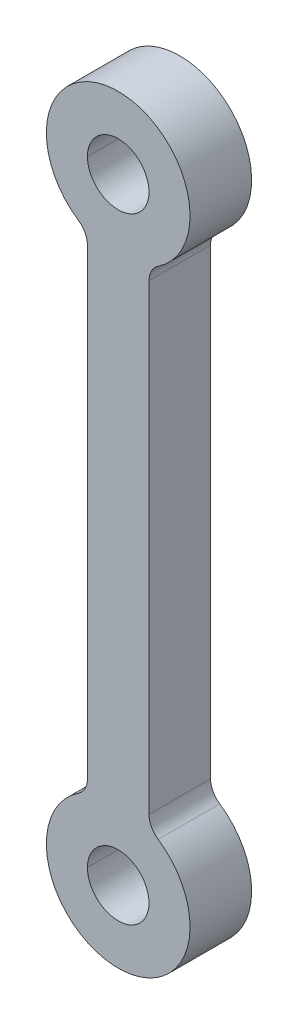
ISO-10303-21;
HEADER;
FILE_DESCRIPTION(('STEP AP214'),'2;1');
FILE_NAME('part.step','',(''),(''),'','','');
FILE_SCHEMA(('AUTOMOTIVE_DESIGN { 1 0 10303 214 1 1 1 1 }'));
ENDSEC;
DATA;
#1=APPLICATION_CONTEXT('core data for automotive mechanical design processes');
#2=APPLICATION_PROTOCOL_DEFINITION('international standard','automotive_design',2000,#1);
#3=PRODUCT_CONTEXT('',#1,'mechanical');
#4=PRODUCT('Part','Part','',(#3));
#5=PRODUCT_RELATED_PRODUCT_CATEGORY('part','',(#4));
#6=PRODUCT_DEFINITION_FORMATION('','',#4);
#7=PRODUCT_DEFINITION_CONTEXT('part definition',#1,'design');
#8=PRODUCT_DEFINITION('design','',#6,#7);
#9=PRODUCT_DEFINITION_SHAPE('','',#8);
#10=(LENGTH_UNIT() NAMED_UNIT(*) SI_UNIT(.MILLI.,.METRE.));
#11=(NAMED_UNIT(*) PLANE_ANGLE_UNIT() SI_UNIT($,.RADIAN.));
#12=(NAMED_UNIT(*) SI_UNIT($,.STERADIAN.) SOLID_ANGLE_UNIT());
#13=UNCERTAINTY_MEASURE_WITH_UNIT(LENGTH_MEASURE(1.E-05),#10,'distance_accuracy_value','');
#14=(GEOMETRIC_REPRESENTATION_CONTEXT(3) GLOBAL_UNCERTAINTY_ASSIGNED_CONTEXT((#13)) GLOBAL_UNIT_ASSIGNED_CONTEXT((#10,
#11,#12)) REPRESENTATION_CONTEXT('',''));
#15=CARTESIAN_POINT('',(0.,0.,0.));
#16=DIRECTION('',(0.,0.,1.));
#17=DIRECTION('',(1.,0.,0.));
#18=AXIS2_PLACEMENT_3D('',#15,#16,#17);
#19=CARTESIAN_POINT('',(-2.5,11.258342613226,1.5));
#20=DIRECTION('',(0.,0.,-1.));
#21=DIRECTION('',(1.,0.,0.));
#22=AXIS2_PLACEMENT_3D('',#19,#20,#21);
#23=CYLINDRICAL_SURFACE('',#22,1.);
#24=DIRECTION('',(0.,0.,-1.));
#25=VECTOR('',#24,1.);
#26=CARTESIAN_POINT('',(-1.5,11.258342613226,1.5));
#27=LINE('',#26,#25);
#28=CARTESIAN_POINT('',(-1.5,11.258342613226,3.));
#29=VERTEX_POINT('',#28);
#30=CARTESIAN_POINT('',(-1.5,11.258342613226,0.));
#31=VERTEX_POINT('',#30);
#32=EDGE_CURVE('E10',#29,#31,#27,.T.);
#33=ORIENTED_EDGE('',*,*,#32,.F.);
#34=CARTESIAN_POINT('',(-2.5,11.258342613226,3.));
#35=DIRECTION('',(0.,0.,-1.));
#36=DIRECTION('',(1.,0.,0.));
#37=AXIS2_PLACEMENT_3D('',#34,#35,#36);
#38=CIRCLE('',#37,1.);
#39=CARTESIAN_POINT('',(-1.94444444444444,12.0898220325091,3.));
#40=VERTEX_POINT('',#39);
#41=EDGE_CURVE('E254',#40,#29,#38,.T.);
#42=ORIENTED_EDGE('',*,*,#41,.F.);
#43=DIRECTION('',(0.,0.,-1.));
#44=VECTOR('',#43,1.);
#45=CARTESIAN_POINT('',(-1.94444444444443,12.0898220325091,1.5));
#46=LINE('',#45,#44);
#47=CARTESIAN_POINT('',(-1.94444444444444,12.0898220325091,0.));
#48=VERTEX_POINT('',#47);
#49=EDGE_CURVE('E26',#40,#48,#46,.T.);
#50=ORIENTED_EDGE('',*,*,#49,.T.);
#51=CARTESIAN_POINT('',(-2.5,11.258342613226,0.));
#52=DIRECTION('',(0.,0.,1.));
#53=DIRECTION('',(1.,0.,0.));
#54=AXIS2_PLACEMENT_3D('',#51,#52,#53);
#55=CIRCLE('',#54,1.);
#56=EDGE_CURVE('E175',#31,#48,#55,.T.);
#57=ORIENTED_EDGE('',*,*,#56,.F.);
#58=EDGE_LOOP('',(#33,#42,#50,#57));
#59=FACE_BOUND('',#58,.T.);
#60=ADVANCED_FACE('F17',(#59),#23,.F.);
#61=CARTESIAN_POINT('',(-1.5,11.8377223398316,0.));
#62=DIRECTION('',(-1.,0.,0.));
#63=DIRECTION('',(0.,-1.,0.));
#64=AXIS2_PLACEMENT_3D('',#61,#62,#63);
#65=PLANE('',#64);
#66=DIRECTION('',(0.,-1.,0.));
#67=VECTOR('',#66,1.);
#68=CARTESIAN_POINT('',(-1.5,0.,0.));
#69=LINE('',#68,#67);
#70=CARTESIAN_POINT('',(-1.5,-11.2583426132261,0.));
#71=VERTEX_POINT('',#70);
#72=EDGE_CURVE('E172',#31,#71,#69,.T.);
#73=ORIENTED_EDGE('',*,*,#72,.T.);
#74=DIRECTION('',(0.,0.,-1.));
#75=VECTOR('',#74,1.);
#76=CARTESIAN_POINT('',(-1.5,-11.2583426132261,1.5));
#77=LINE('',#76,#75);
#78=CARTESIAN_POINT('',(-1.5,-11.2583426132261,3.));
#79=VERTEX_POINT('',#78);
#80=EDGE_CURVE('E204',#79,#71,#77,.T.);
#81=ORIENTED_EDGE('',*,*,#80,.F.);
#82=DIRECTION('',(0.,-1.,0.));
#83=VECTOR('',#82,1.);
#84=CARTESIAN_POINT('',(-1.5,0.,3.));
#85=LINE('',#84,#83);
#86=EDGE_CURVE('E258',#29,#79,#85,.T.);
#87=ORIENTED_EDGE('',*,*,#86,.F.);
#88=ORIENTED_EDGE('',*,*,#32,.T.);
#89=EDGE_LOOP('',(#73,#81,#87,#88));
#90=FACE_BOUND('',#89,.T.);
#91=ADVANCED_FACE('F19',(#90),#65,.T.);
#92=CARTESIAN_POINT('',(0.,15.,1.5));
#93=DIRECTION('',(0.,0.,-1.));
#94=DIRECTION('',(1.,0.,0.));
#95=AXIS2_PLACEMENT_3D('',#92,#93,#94);
#96=CYLINDRICAL_SURFACE('',#95,3.5);
#97=CARTESIAN_POINT('',(0.,15.,3.));
#98=DIRECTION('',(0.,0.,1.));
#99=DIRECTION('',(1.,0.,0.));
#100=AXIS2_PLACEMENT_3D('',#97,#98,#99);
#101=CIRCLE('',#100,3.5);
#102=CARTESIAN_POINT('',(1.94444444444443,12.0898220325091,3.));
#103=VERTEX_POINT('',#102);
#104=EDGE_CURVE('E261',#103,#40,#101,.T.);
#105=ORIENTED_EDGE('',*,*,#104,.F.);
#106=DIRECTION('',(0.,0.,-1.));
#107=VECTOR('',#106,1.);
#108=CARTESIAN_POINT('',(1.94444444444443,12.0898220325091,1.5));
#109=LINE('',#108,#107);
#110=CARTESIAN_POINT('',(1.94444444444443,12.0898220325091,0.));
#111=VERTEX_POINT('',#110);
#112=EDGE_CURVE('E171',#103,#111,#109,.T.);
#113=ORIENTED_EDGE('',*,*,#112,.T.);
#114=CARTESIAN_POINT('',(0.,15.,0.));
#115=DIRECTION('',(0.,0.,1.));
#116=DIRECTION('',(1.,0.,0.));
#117=AXIS2_PLACEMENT_3D('',#114,#115,#116);
#118=CIRCLE('',#117,3.5);
#119=EDGE_CURVE('E176',#111,#48,#118,.T.);
#120=ORIENTED_EDGE('',*,*,#119,.T.);
#121=ORIENTED_EDGE('',*,*,#49,.F.);
#122=EDGE_LOOP('',(#105,#113,#120,#121));
#123=FACE_BOUND('',#122,.T.);
#124=ADVANCED_FACE('F585',(#123),#96,.T.);
#125=CARTESIAN_POINT('',(0.,0.,0.));
#126=DIRECTION('',(0.,0.,1.));
#127=DIRECTION('',(1.,0.,0.));
#128=AXIS2_PLACEMENT_3D('',#125,#126,#127);
#129=PLANE('',#128);
#130=CARTESIAN_POINT('',(0.,-15.,0.));
#131=DIRECTION('',(0.,0.,1.));
#132=DIRECTION('',(1.,0.,0.));
#133=AXIS2_PLACEMENT_3D('',#130,#131,#132);
#134=CIRCLE('',#133,1.5);
#135=CARTESIAN_POINT('',(1.5,-15.,0.));
#136=VERTEX_POINT('',#135);
#137=CARTESIAN_POINT('',(-1.5,-15.,0.));
#138=VERTEX_POINT('',#137);
#139=EDGE_CURVE('E203',#136,#138,#134,.T.);
#140=ORIENTED_EDGE('',*,*,#139,.T.);
#141=CARTESIAN_POINT('',(0.,-15.,0.));
#142=DIRECTION('',(0.,0.,1.));
#143=DIRECTION('',(1.,0.,0.));
#144=AXIS2_PLACEMENT_3D('',#141,#142,#143);
#145=CIRCLE('',#144,1.5);
#146=EDGE_CURVE('E180',#138,#136,#145,.T.);
#147=ORIENTED_EDGE('',*,*,#146,.T.);
#148=EDGE_LOOP('',(#140,#147));
#149=FACE_BOUND('',#148,.T.);
#150=CARTESIAN_POINT('',(0.,15.,0.));
#151=DIRECTION('',(0.,0.,1.));
#152=DIRECTION('',(1.,0.,0.));
#153=AXIS2_PLACEMENT_3D('',#150,#151,#152);
#154=CIRCLE('',#153,1.5);
#155=CARTESIAN_POINT('',(1.5,15.,0.));
#156=VERTEX_POINT('',#155);
#157=CARTESIAN_POINT('',(-1.5,15.,0.));
#158=VERTEX_POINT('',#157);
#159=EDGE_CURVE('E135',#156,#158,#154,.T.);
#160=ORIENTED_EDGE('',*,*,#159,.T.);
#161=CARTESIAN_POINT('',(0.,15.,0.));
#162=DIRECTION('',(0.,0.,1.));
#163=DIRECTION('',(1.,0.,0.));
#164=AXIS2_PLACEMENT_3D('',#161,#162,#163);
#165=CIRCLE('',#164,1.5);
#166=EDGE_CURVE('E141',#158,#156,#165,.T.);
#167=ORIENTED_EDGE('',*,*,#166,.T.);
#168=EDGE_LOOP('',(#160,#167));
#169=FACE_BOUND('',#168,.T.);
#170=ORIENTED_EDGE('',*,*,#119,.F.);
#171=CARTESIAN_POINT('',(2.5,11.258342613226,0.));
#172=DIRECTION('',(0.,0.,1.));
#173=DIRECTION('',(1.,0.,0.));
#174=AXIS2_PLACEMENT_3D('',#171,#172,#173);
#175=CIRCLE('',#174,1.);
#176=CARTESIAN_POINT('',(1.49999999999998,11.258342613226,0.));
#177=VERTEX_POINT('',#176);
#178=EDGE_CURVE('E196',#111,#177,#175,.T.);
#179=ORIENTED_EDGE('',*,*,#178,.T.);
#180=DIRECTION('',(0.,1.,0.));
#181=VECTOR('',#180,1.);
#182=CARTESIAN_POINT('',(1.49999999999998,0.,0.));
#183=LINE('',#182,#181);
#184=CARTESIAN_POINT('',(1.49999999999998,-11.258342613226,0.));
#185=VERTEX_POINT('',#184);
#186=EDGE_CURVE('E218',#185,#177,#183,.T.);
#187=ORIENTED_EDGE('',*,*,#186,.F.);
#188=CARTESIAN_POINT('',(2.5,-11.258342613226,0.));
#189=DIRECTION('',(0.,0.,1.));
#190=DIRECTION('',(1.,0.,0.));
#191=AXIS2_PLACEMENT_3D('',#188,#189,#190);
#192=CIRCLE('',#191,1.);
#193=CARTESIAN_POINT('',(1.94444444444443,-12.0898220325091,0.));
#194=VERTEX_POINT('',#193);
#195=EDGE_CURVE('E235',#185,#194,#192,.T.);
#196=ORIENTED_EDGE('',*,*,#195,.T.);
#197=CARTESIAN_POINT('',(0.,-15.,0.));
#198=DIRECTION('',(0.,0.,1.));
#199=DIRECTION('',(1.,0.,0.));
#200=AXIS2_PLACEMENT_3D('',#197,#198,#199);
#201=CIRCLE('',#200,3.5);
#202=CARTESIAN_POINT('',(-1.94444444444444,-12.0898220325092,0.));
#203=VERTEX_POINT('',#202);
#204=EDGE_CURVE('E239',#203,#194,#201,.T.);
#205=ORIENTED_EDGE('',*,*,#204,.F.);
#206=CARTESIAN_POINT('',(-2.5,-11.2583426132261,0.));
#207=DIRECTION('',(0.,0.,1.));
#208=DIRECTION('',(1.,0.,0.));
#209=AXIS2_PLACEMENT_3D('',#206,#207,#208);
#210=CIRCLE('',#209,1.);
#211=EDGE_CURVE('E208',#203,#71,#210,.T.);
#212=ORIENTED_EDGE('',*,*,#211,.T.);
#213=ORIENTED_EDGE('',*,*,#72,.F.);
#214=ORIENTED_EDGE('',*,*,#56,.T.);
#215=EDGE_LOOP('',(#170,#179,#187,#196,#205,#212,#213,#214));
#216=FACE_BOUND('',#215,.T.);
#217=ADVANCED_FACE('F138',(#149,#169,#216),#129,.F.);
#218=CARTESIAN_POINT('',(0.,0.,3.));
#219=DIRECTION('',(0.,0.,1.));
#220=DIRECTION('',(1.,0.,0.));
#221=AXIS2_PLACEMENT_3D('',#218,#219,#220);
#222=PLANE('',#221);
#223=CARTESIAN_POINT('',(0.,-15.,3.));
#224=DIRECTION('',(0.,0.,1.));
#225=DIRECTION('',(1.,0.,0.));
#226=AXIS2_PLACEMENT_3D('',#223,#224,#225);
#227=CIRCLE('',#226,1.5);
#228=CARTESIAN_POINT('',(-1.5,-15.,3.));
#229=VERTEX_POINT('',#228);
#230=CARTESIAN_POINT('',(1.5,-15.,3.));
#231=VERTEX_POINT('',#230);
#232=EDGE_CURVE('E146',#229,#231,#227,.T.);
#233=ORIENTED_EDGE('',*,*,#232,.F.);
#234=CARTESIAN_POINT('',(0.,-15.,3.));
#235=DIRECTION('',(0.,0.,1.));
#236=DIRECTION('',(1.,0.,0.));
#237=AXIS2_PLACEMENT_3D('',#234,#235,#236);
#238=CIRCLE('',#237,1.5);
#239=EDGE_CURVE('E186',#231,#229,#238,.T.);
#240=ORIENTED_EDGE('',*,*,#239,.F.);
#241=EDGE_LOOP('',(#233,#240));
#242=FACE_BOUND('',#241,.T.);
#243=CARTESIAN_POINT('',(0.,15.,3.));
#244=DIRECTION('',(0.,0.,1.));
#245=DIRECTION('',(1.,0.,0.));
#246=AXIS2_PLACEMENT_3D('',#243,#244,#245);
#247=CIRCLE('',#246,1.5);
#248=CARTESIAN_POINT('',(-1.5,15.,3.));
#249=VERTEX_POINT('',#248);
#250=CARTESIAN_POINT('',(1.5,15.,3.));
#251=VERTEX_POINT('',#250);
#252=EDGE_CURVE('E167',#249,#251,#247,.T.);
#253=ORIENTED_EDGE('',*,*,#252,.F.);
#254=CARTESIAN_POINT('',(0.,15.,3.));
#255=DIRECTION('',(0.,0.,1.));
#256=DIRECTION('',(1.,0.,0.));
#257=AXIS2_PLACEMENT_3D('',#254,#255,#256);
#258=CIRCLE('',#257,1.5);
#259=EDGE_CURVE('E147',#251,#249,#258,.T.);
#260=ORIENTED_EDGE('',*,*,#259,.F.);
#261=EDGE_LOOP('',(#253,#260));
#262=FACE_BOUND('',#261,.T.);
#263=ORIENTED_EDGE('',*,*,#41,.T.);
#264=ORIENTED_EDGE('',*,*,#86,.T.);
#265=CARTESIAN_POINT('',(-2.5,-11.2583426132261,3.));
#266=DIRECTION('',(0.,0.,-1.));
#267=DIRECTION('',(1.,0.,0.));
#268=AXIS2_PLACEMENT_3D('',#265,#266,#267);
#269=CIRCLE('',#268,1.);
#270=CARTESIAN_POINT('',(-1.94444444444444,-12.0898220325092,3.));
#271=VERTEX_POINT('',#270);
#272=EDGE_CURVE('E209',#79,#271,#269,.T.);
#273=ORIENTED_EDGE('',*,*,#272,.T.);
#274=CARTESIAN_POINT('',(0.,-15.,3.));
#275=DIRECTION('',(0.,0.,1.));
#276=DIRECTION('',(1.,0.,0.));
#277=AXIS2_PLACEMENT_3D('',#274,#275,#276);
#278=CIRCLE('',#277,3.5);
#279=CARTESIAN_POINT('',(1.94444444444443,-12.0898220325091,3.));
#280=VERTEX_POINT('',#279);
#281=EDGE_CURVE('E242',#271,#280,#278,.T.);
#282=ORIENTED_EDGE('',*,*,#281,.T.);
#283=CARTESIAN_POINT('',(2.5,-11.258342613226,3.));
#284=DIRECTION('',(0.,0.,-1.));
#285=DIRECTION('',(1.,0.,0.));
#286=AXIS2_PLACEMENT_3D('',#283,#284,#285);
#287=CIRCLE('',#286,1.);
#288=CARTESIAN_POINT('',(1.49999999999998,-11.258342613226,3.));
#289=VERTEX_POINT('',#288);
#290=EDGE_CURVE('E228',#280,#289,#287,.T.);
#291=ORIENTED_EDGE('',*,*,#290,.T.);
#292=DIRECTION('',(0.,1.,0.));
#293=VECTOR('',#292,1.);
#294=CARTESIAN_POINT('',(1.49999999999998,0.,3.));
#295=LINE('',#294,#293);
#296=CARTESIAN_POINT('',(1.49999999999998,11.258342613226,3.));
#297=VERTEX_POINT('',#296);
#298=EDGE_CURVE('E221',#289,#297,#295,.T.);
#299=ORIENTED_EDGE('',*,*,#298,.T.);
#300=CARTESIAN_POINT('',(2.5,11.258342613226,3.));
#301=DIRECTION('',(0.,0.,-1.));
#302=DIRECTION('',(1.,0.,0.));
#303=AXIS2_PLACEMENT_3D('',#300,#301,#302);
#304=CIRCLE('',#303,1.);
#305=EDGE_CURVE('E197',#297,#103,#304,.T.);
#306=ORIENTED_EDGE('',*,*,#305,.T.);
#307=ORIENTED_EDGE('',*,*,#104,.T.);
#308=EDGE_LOOP('',(#263,#264,#273,#282,#291,#299,#306,#307));
#309=FACE_BOUND('',#308,.T.);
#310=ADVANCED_FACE('F508',(#242,#262,#309),#222,.T.);
#311=CARTESIAN_POINT('',(-2.5,-11.2583426132261,1.5));
#312=DIRECTION('',(0.,0.,-1.));
#313=DIRECTION('',(0.555555555555554,-0.8314794192831,0.));
#314=AXIS2_PLACEMENT_3D('',#311,#312,#313);
#315=CYLINDRICAL_SURFACE('',#314,1.);
#316=DIRECTION('',(0.,0.,-1.));
#317=VECTOR('',#316,1.);
#318=CARTESIAN_POINT('',(-1.94444444444444,-12.0898220325092,1.5));
#319=LINE('',#318,#317);
#320=EDGE_CURVE('E245',#271,#203,#319,.T.);
#321=ORIENTED_EDGE('',*,*,#320,.F.);
#322=ORIENTED_EDGE('',*,*,#272,.F.);
#323=ORIENTED_EDGE('',*,*,#80,.T.);
#324=ORIENTED_EDGE('',*,*,#211,.F.);
#325=EDGE_LOOP('',(#321,#322,#323,#324));
#326=FACE_BOUND('',#325,.T.);
#327=ADVANCED_FACE('F563',(#326),#315,.F.);
#328=CARTESIAN_POINT('',(0.,-15.,1.5));
#329=DIRECTION('',(0.,0.,-1.));
#330=DIRECTION('',(1.,0.,0.));
#331=AXIS2_PLACEMENT_3D('',#328,#329,#330);
#332=CYLINDRICAL_SURFACE('',#331,3.5);
#333=ORIENTED_EDGE('',*,*,#204,.T.);
#334=DIRECTION('',(0.,0.,-1.));
#335=VECTOR('',#334,1.);
#336=CARTESIAN_POINT('',(1.94444444444443,-12.0898220325091,1.5));
#337=LINE('',#336,#335);
#338=EDGE_CURVE('E231',#280,#194,#337,.T.);
#339=ORIENTED_EDGE('',*,*,#338,.F.);
#340=ORIENTED_EDGE('',*,*,#281,.F.);
#341=ORIENTED_EDGE('',*,*,#320,.T.);
#342=EDGE_LOOP('',(#333,#339,#340,#341));
#343=FACE_BOUND('',#342,.T.);
#344=ADVANCED_FACE('F556',(#343),#332,.T.);
#345=CARTESIAN_POINT('',(2.5,-11.258342613226,1.5));
#346=DIRECTION('',(0.,0.,-1.));
#347=DIRECTION('',(-1.,0.,0.));
#348=AXIS2_PLACEMENT_3D('',#345,#346,#347);
#349=CYLINDRICAL_SURFACE('',#348,1.);
#350=DIRECTION('',(0.,0.,-1.));
#351=VECTOR('',#350,1.);
#352=CARTESIAN_POINT('',(1.49999999999998,-11.258342613226,1.5));
#353=LINE('',#352,#351);
#354=EDGE_CURVE('E224',#289,#185,#353,.T.);
#355=ORIENTED_EDGE('',*,*,#354,.F.);
#356=ORIENTED_EDGE('',*,*,#290,.F.);
#357=ORIENTED_EDGE('',*,*,#338,.T.);
#358=ORIENTED_EDGE('',*,*,#195,.F.);
#359=EDGE_LOOP('',(#355,#356,#357,#358));
#360=FACE_BOUND('',#359,.T.);
#361=ADVANCED_FACE('F550',(#360),#349,.F.);
#362=CARTESIAN_POINT('',(1.49999999999998,-11.8377223398316,0.));
#363=DIRECTION('',(1.,0.,0.));
#364=DIRECTION('',(0.,1.,0.));
#365=AXIS2_PLACEMENT_3D('',#362,#363,#364);
#366=PLANE('',#365);
#367=ORIENTED_EDGE('',*,*,#186,.T.);
#368=DIRECTION('',(0.,0.,-1.));
#369=VECTOR('',#368,1.);
#370=CARTESIAN_POINT('',(1.49999999999998,11.258342613226,1.5));
#371=LINE('',#370,#369);
#372=EDGE_CURVE('E192',#297,#177,#371,.T.);
#373=ORIENTED_EDGE('',*,*,#372,.F.);
#374=ORIENTED_EDGE('',*,*,#298,.F.);
#375=ORIENTED_EDGE('',*,*,#354,.T.);
#376=EDGE_LOOP('',(#367,#373,#374,#375));
#377=FACE_BOUND('',#376,.T.);
#378=ADVANCED_FACE('F543',(#377),#366,.T.);
#379=CARTESIAN_POINT('',(2.5,11.258342613226,1.5));
#380=DIRECTION('',(0.,0.,-1.));
#381=DIRECTION('',(-0.555555555555551,0.831479419283101,0.));
#382=AXIS2_PLACEMENT_3D('',#379,#380,#381);
#383=CYLINDRICAL_SURFACE('',#382,1.);
#384=ORIENTED_EDGE('',*,*,#112,.F.);
#385=ORIENTED_EDGE('',*,*,#305,.F.);
#386=ORIENTED_EDGE('',*,*,#372,.T.);
#387=ORIENTED_EDGE('',*,*,#178,.F.);
#388=EDGE_LOOP('',(#384,#385,#386,#387));
#389=FACE_BOUND('',#388,.T.);
#390=ADVANCED_FACE('F537',(#389),#383,.F.);
#391=CARTESIAN_POINT('',(0.,-15.,1.5));
#392=DIRECTION('',(0.,0.,-1.));
#393=DIRECTION('',(1.,0.,0.));
#394=AXIS2_PLACEMENT_3D('',#391,#392,#393);
#395=CYLINDRICAL_SURFACE('',#394,1.5);
#396=ORIENTED_EDGE('',*,*,#239,.T.);
#397=DIRECTION('',(0.,0.,1.));
#398=VECTOR('',#397,1.);
#399=CARTESIAN_POINT('',(-1.5,-15.,1.5));
#400=LINE('',#399,#398);
#401=EDGE_CURVE('E182',#138,#229,#400,.T.);
#402=ORIENTED_EDGE('',*,*,#401,.F.);
#403=ORIENTED_EDGE('',*,*,#139,.F.);
#404=DIRECTION('',(0.,0.,1.));
#405=VECTOR('',#404,1.);
#406=CARTESIAN_POINT('',(1.5,-15.,1.5));
#407=LINE('',#406,#405);
#408=EDGE_CURVE('E177',#136,#231,#407,.T.);
#409=ORIENTED_EDGE('',*,*,#408,.T.);
#410=EDGE_LOOP('',(#396,#402,#403,#409));
#411=FACE_BOUND('',#410,.T.);
#412=ADVANCED_FACE('F530',(#411),#395,.F.);
#413=CARTESIAN_POINT('',(0.,-15.,1.5));
#414=DIRECTION('',(0.,0.,-1.));
#415=DIRECTION('',(1.,0.,0.));
#416=AXIS2_PLACEMENT_3D('',#413,#414,#415);
#417=CYLINDRICAL_SURFACE('',#416,1.5);
#418=ORIENTED_EDGE('',*,*,#232,.T.);
#419=ORIENTED_EDGE('',*,*,#408,.F.);
#420=ORIENTED_EDGE('',*,*,#146,.F.);
#421=ORIENTED_EDGE('',*,*,#401,.T.);
#422=EDGE_LOOP('',(#418,#419,#420,#421));
#423=FACE_BOUND('',#422,.T.);
#424=ADVANCED_FACE('F524',(#423),#417,.F.);
#425=CARTESIAN_POINT('',(0.,15.,1.5));
#426=DIRECTION('',(0.,0.,-1.));
#427=DIRECTION('',(1.,0.,0.));
#428=AXIS2_PLACEMENT_3D('',#425,#426,#427);
#429=CYLINDRICAL_SURFACE('',#428,1.5);
#430=ORIENTED_EDGE('',*,*,#259,.T.);
#431=DIRECTION('',(0.,0.,1.));
#432=VECTOR('',#431,1.);
#433=CARTESIAN_POINT('',(-1.5,15.,1.5));
#434=LINE('',#433,#432);
#435=EDGE_CURVE('E150',#158,#249,#434,.T.);
#436=ORIENTED_EDGE('',*,*,#435,.F.);
#437=ORIENTED_EDGE('',*,*,#159,.F.);
#438=DIRECTION('',(0.,0.,1.));
#439=VECTOR('',#438,1.);
#440=CARTESIAN_POINT('',(1.5,15.,1.5));
#441=LINE('',#440,#439);
#442=EDGE_CURVE('E160',#156,#251,#441,.T.);
#443=ORIENTED_EDGE('',*,*,#442,.T.);
#444=EDGE_LOOP('',(#430,#436,#437,#443));
#445=FACE_BOUND('',#444,.T.);
#446=ADVANCED_FACE('F152',(#445),#429,.F.);
#447=CARTESIAN_POINT('',(0.,15.,1.5));
#448=DIRECTION('',(0.,0.,-1.));
#449=DIRECTION('',(1.,0.,0.));
#450=AXIS2_PLACEMENT_3D('',#447,#448,#449);
#451=CYLINDRICAL_SURFACE('',#450,1.5);
#452=ORIENTED_EDGE('',*,*,#252,.T.);
#453=ORIENTED_EDGE('',*,*,#442,.F.);
#454=ORIENTED_EDGE('',*,*,#166,.F.);
#455=ORIENTED_EDGE('',*,*,#435,.T.);
#456=EDGE_LOOP('',(#452,#453,#454,#455));
#457=FACE_BOUND('',#456,.T.);
#458=ADVANCED_FACE('F159',(#457),#451,.F.);
#459=CLOSED_SHELL('',(#60,#91,#124,#217,#310,#327,#344,#361,#378,#390,#412,#424,#446,#458));
#460=MANIFOLD_SOLID_BREP('B1',#459);
#461=ADVANCED_BREP_SHAPE_REPRESENTATION('',(#18,#460),#14);
#462=SHAPE_DEFINITION_REPRESENTATION(#9,#461);
ENDSEC;
END-ISO-10303-21;
